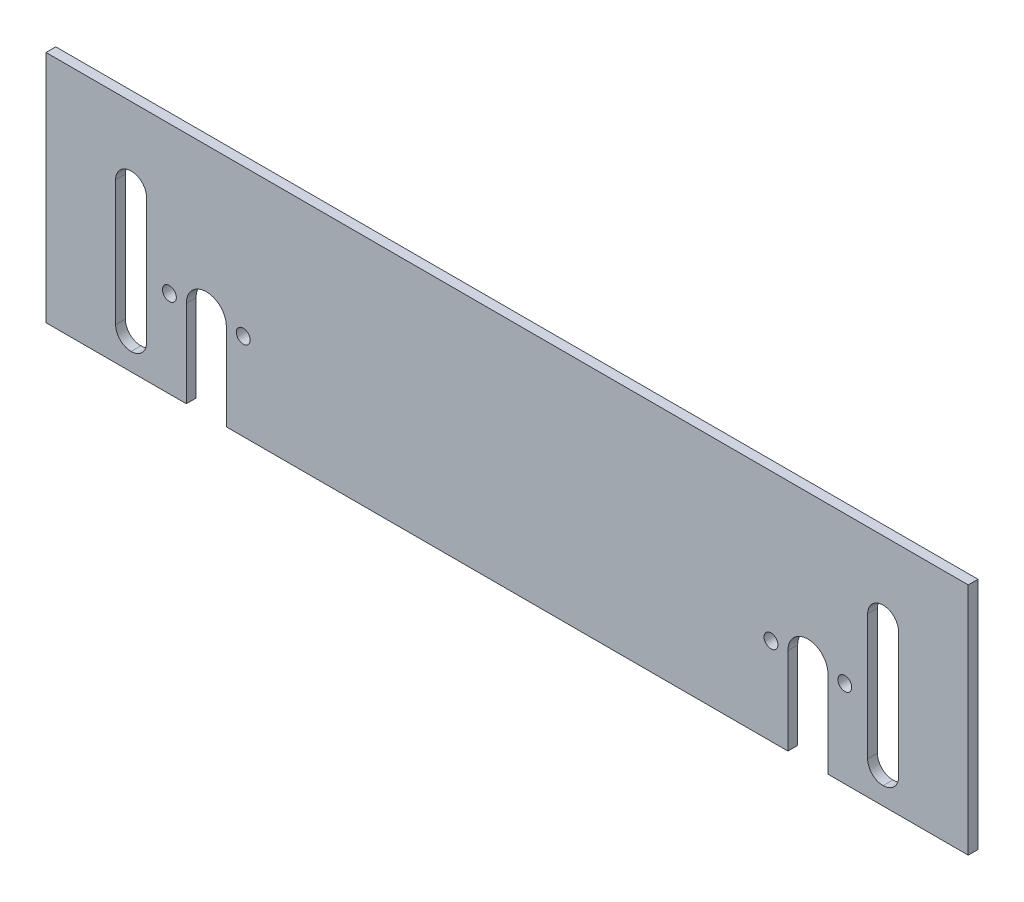
ISO-10303-21;
HEADER;
FILE_DESCRIPTION(('STEP AP214'),'2;1');
FILE_NAME('part.step','',(''),(''),'','','');
FILE_SCHEMA(('AUTOMOTIVE_DESIGN { 1 0 10303 214 1 1 1 1 }'));
ENDSEC;
DATA;
#1=APPLICATION_CONTEXT('core data for automotive mechanical design processes');
#2=APPLICATION_PROTOCOL_DEFINITION('international standard','automotive_design',2000,#1);
#3=PRODUCT_CONTEXT('',#1,'mechanical');
#4=PRODUCT('Part','Part','',(#3));
#5=PRODUCT_RELATED_PRODUCT_CATEGORY('part','',(#4));
#6=PRODUCT_DEFINITION_FORMATION('','',#4);
#7=PRODUCT_DEFINITION_CONTEXT('part definition',#1,'design');
#8=PRODUCT_DEFINITION('design','',#6,#7);
#9=PRODUCT_DEFINITION_SHAPE('','',#8);
#10=(LENGTH_UNIT() NAMED_UNIT(*) SI_UNIT(.MILLI.,.METRE.));
#11=(NAMED_UNIT(*) PLANE_ANGLE_UNIT() SI_UNIT($,.RADIAN.));
#12=(NAMED_UNIT(*) SI_UNIT($,.STERADIAN.) SOLID_ANGLE_UNIT());
#13=UNCERTAINTY_MEASURE_WITH_UNIT(LENGTH_MEASURE(1.E-05),#10,'distance_accuracy_value','');
#14=(GEOMETRIC_REPRESENTATION_CONTEXT(3) GLOBAL_UNCERTAINTY_ASSIGNED_CONTEXT((#13)) GLOBAL_UNIT_ASSIGNED_CONTEXT((#10,
#11,#12)) REPRESENTATION_CONTEXT('',''));
#15=CARTESIAN_POINT('',(0.,0.,0.));
#16=DIRECTION('',(0.,0.,1.));
#17=DIRECTION('',(1.,0.,0.));
#18=AXIS2_PLACEMENT_3D('',#15,#16,#17);
#19=CARTESIAN_POINT('',(0.,0.,3.175));
#20=DIRECTION('',(0.,0.,1.));
#21=DIRECTION('',(1.,0.,0.));
#22=AXIS2_PLACEMENT_3D('',#19,#20,#21);
#23=PLANE('',#22);
#24=CARTESIAN_POINT('',(85.7499999999999,-9.76249999999997,3.17500000000054));
#25=DIRECTION('',(0.,0.,-1.));
#26=DIRECTION('',(-1.,0.,0.));
#27=AXIS2_PLACEMENT_3D('',#24,#25,#26);
#28=CIRCLE('',#27,2.25);
#29=CARTESIAN_POINT('',(83.4999999999999,-9.76249999999997,3.17500000000054));
#30=VERTEX_POINT('',#29);
#31=EDGE_CURVE('E763',#30,#30,#28,.T.);
#32=ORIENTED_EDGE('',*,*,#31,.T.);
#33=EDGE_LOOP('',(#32));
#34=FACE_BOUND('',#33,.T.);
#35=CARTESIAN_POINT('',(109.75,-9.76249999999997,3.17500000000054));
#36=DIRECTION('',(0.,0.,-1.));
#37=DIRECTION('',(-1.,0.,0.));
#38=AXIS2_PLACEMENT_3D('',#35,#36,#37);
#39=CIRCLE('',#38,2.25);
#40=CARTESIAN_POINT('',(107.5,-9.76249999999997,3.17500000000054));
#41=VERTEX_POINT('',#40);
#42=EDGE_CURVE('E773',#41,#41,#39,.T.);
#43=ORIENTED_EDGE('',*,*,#42,.T.);
#44=EDGE_LOOP('',(#43));
#45=FACE_BOUND('',#44,.T.);
#46=CARTESIAN_POINT('',(-109.75,-9.76249999999999,3.17500000000054));
#47=DIRECTION('',(0.,0.,-1.));
#48=DIRECTION('',(-1.,0.,0.));
#49=AXIS2_PLACEMENT_3D('',#46,#47,#48);
#50=CIRCLE('',#49,2.25);
#51=CARTESIAN_POINT('',(-112.,-9.76249999999999,3.17500000000054));
#52=VERTEX_POINT('',#51);
#53=EDGE_CURVE('E779',#52,#52,#50,.T.);
#54=ORIENTED_EDGE('',*,*,#53,.T.);
#55=EDGE_LOOP('',(#54));
#56=FACE_BOUND('',#55,.T.);
#57=DIRECTION('',(1.,0.,0.));
#58=VECTOR('',#57,1.);
#59=CARTESIAN_POINT('',(-149.85,-38.0375,3.175));
#60=LINE('',#59,#58);
#61=CARTESIAN_POINT('',(-91.2500000000002,-38.0374999999988,3.17499999999994));
#62=VERTEX_POINT('',#61);
#63=CARTESIAN_POINT('',(91.2499999999999,-38.0374999999996,3.17499999999994));
#64=VERTEX_POINT('',#63);
#65=EDGE_CURVE('E421',#62,#64,#60,.T.);
#66=ORIENTED_EDGE('',*,*,#65,.T.);
#67=DIRECTION('',(0.,-0.999999999999986,0.));
#68=VECTOR('',#67,1.);
#69=CARTESIAN_POINT('',(91.2499999999999,0.,3.17499999999994));
#70=LINE('',#69,#68);
#71=CARTESIAN_POINT('',(91.2499999999999,-9.76249999999996,3.175));
#72=VERTEX_POINT('',#71);
#73=EDGE_CURVE('E235',#72,#64,#70,.T.);
#74=ORIENTED_EDGE('',*,*,#73,.F.);
#75=CARTESIAN_POINT('',(97.7499999999999,-9.76249999999997,3.17500000000006));
#76=DIRECTION('',(0.,0.,-0.999999999999993));
#77=DIRECTION('',(-1.,0.,0.));
#78=AXIS2_PLACEMENT_3D('',#75,#76,#77);
#79=CIRCLE('',#78,6.5);
#80=CARTESIAN_POINT('',(104.25,-9.76249999999997,3.175));
#81=VERTEX_POINT('',#80);
#82=EDGE_CURVE('E230',#72,#81,#79,.T.);
#83=ORIENTED_EDGE('',*,*,#82,.T.);
#84=DIRECTION('',(0.,-0.999999999999986,0.));
#85=VECTOR('',#84,1.);
#86=CARTESIAN_POINT('',(104.25,0.,3.17499999999994));
#87=LINE('',#86,#85);
#88=CARTESIAN_POINT('',(104.25,-38.0374999999996,3.17499999999994));
#89=VERTEX_POINT('',#88);
#90=EDGE_CURVE('E238',#81,#89,#87,.T.);
#91=ORIENTED_EDGE('',*,*,#90,.T.);
#92=CARTESIAN_POINT('',(149.85,-38.0375,3.175));
#93=VERTEX_POINT('',#92);
#94=EDGE_CURVE('E416',#89,#93,#60,.T.);
#95=ORIENTED_EDGE('',*,*,#94,.T.);
#96=DIRECTION('',(0.,1.,0.));
#97=VECTOR('',#96,1.);
#98=CARTESIAN_POINT('',(149.85,38.0375,3.175));
#99=LINE('',#98,#97);
#100=CARTESIAN_POINT('',(149.85,38.0375,3.175));
#101=VERTEX_POINT('',#100);
#102=EDGE_CURVE('E408',#93,#101,#99,.T.);
#103=ORIENTED_EDGE('',*,*,#102,.T.);
#104=DIRECTION('',(-1.,0.,0.));
#105=VECTOR('',#104,1.);
#106=CARTESIAN_POINT('',(-149.85,38.0375,3.175));
#107=LINE('',#106,#105);
#108=CARTESIAN_POINT('',(-149.85,38.0375,3.175));
#109=VERTEX_POINT('',#108);
#110=EDGE_CURVE('E411',#101,#109,#107,.T.);
#111=ORIENTED_EDGE('',*,*,#110,.T.);
#112=DIRECTION('',(0.,-1.,0.));
#113=VECTOR('',#112,1.);
#114=CARTESIAN_POINT('',(-149.85,38.0375,3.175));
#115=LINE('',#114,#113);
#116=CARTESIAN_POINT('',(-149.85,-38.0375,3.175));
#117=VERTEX_POINT('',#116);
#118=EDGE_CURVE('E414',#109,#117,#115,.T.);
#119=ORIENTED_EDGE('',*,*,#118,.T.);
#120=CARTESIAN_POINT('',(-104.25,-38.0374999999988,3.17499999999994));
#121=VERTEX_POINT('',#120);
#122=EDGE_CURVE('E417',#117,#121,#60,.T.);
#123=ORIENTED_EDGE('',*,*,#122,.T.);
#124=DIRECTION('',(0.,-0.999999999999962,0.));
#125=VECTOR('',#124,1.);
#126=CARTESIAN_POINT('',(-104.25,0.,3.17500000000054));
#127=LINE('',#126,#125);
#128=CARTESIAN_POINT('',(-104.25,-9.76250000000003,3.17500000000048));
#129=VERTEX_POINT('',#128);
#130=EDGE_CURVE('E270',#129,#121,#127,.T.);
#131=ORIENTED_EDGE('',*,*,#130,.F.);
#132=CARTESIAN_POINT('',(-97.7500000000002,-9.76250000000003,3.17500000000042));
#133=DIRECTION('',(0.,0.,-0.99999999999997));
#134=DIRECTION('',(-1.,0.,0.));
#135=AXIS2_PLACEMENT_3D('',#132,#133,#134);
#136=CIRCLE('',#135,6.5);
#137=CARTESIAN_POINT('',(-91.2500000000002,-9.76250000000003,3.17500000000018));
#138=VERTEX_POINT('',#137);
#139=EDGE_CURVE('E263',#129,#138,#136,.T.);
#140=ORIENTED_EDGE('',*,*,#139,.T.);
#141=DIRECTION('',(0.,-0.999999999999962,0.));
#142=VECTOR('',#141,1.);
#143=CARTESIAN_POINT('',(-91.2500000000002,0.,3.17499999999994));
#144=LINE('',#143,#142);
#145=EDGE_CURVE('E266',#138,#62,#144,.T.);
#146=ORIENTED_EDGE('',*,*,#145,.T.);
#147=EDGE_LOOP('',(#66,#74,#83,#91,#95,#103,#111,#119,#123,#131,#140,#146));
#148=FACE_BOUND('',#147,.T.);
#149=DIRECTION('',(0.,-1.,0.));
#150=VECTOR('',#149,1.);
#151=CARTESIAN_POINT('',(-117.160899999998,-27.2824354006741,3.175));
#152=LINE('',#151,#150);
#153=CARTESIAN_POINT('',(-117.160899999998,13.5125,3.175));
#154=VERTEX_POINT('',#153);
#155=CARTESIAN_POINT('',(-117.160899999998,-27.2824354006741,3.175));
#156=VERTEX_POINT('',#155);
#157=EDGE_CURVE('E306',#154,#156,#152,.T.);
#158=ORIENTED_EDGE('',*,*,#157,.T.);
#159=CARTESIAN_POINT('',(-122.160899999998,-27.2824354006741,3.175));
#160=DIRECTION('',(0.,0.,-1.));
#161=DIRECTION('',(1.,0.,0.));
#162=AXIS2_PLACEMENT_3D('',#159,#160,#161);
#163=CIRCLE('',#162,5.);
#164=CARTESIAN_POINT('',(-122.160899999998,-32.2824354006741,3.175));
#165=VERTEX_POINT('',#164);
#166=EDGE_CURVE('E259',#156,#165,#163,.T.);
#167=ORIENTED_EDGE('',*,*,#166,.T.);
#168=DIRECTION('',(-1.,0.,0.));
#169=VECTOR('',#168,1.);
#170=CARTESIAN_POINT('',(-122.160899999998,-32.2824354006741,3.175));
#171=LINE('',#170,#169);
#172=CARTESIAN_POINT('',(-122.224699999998,-32.2824354006741,3.175));
#173=VERTEX_POINT('',#172);
#174=EDGE_CURVE('E288',#165,#173,#171,.T.);
#175=ORIENTED_EDGE('',*,*,#174,.T.);
#176=CARTESIAN_POINT('',(-122.224699999998,-27.2824354006741,3.175));
#177=DIRECTION('',(0.,0.,-1.));
#178=DIRECTION('',(-1.,0.,0.));
#179=AXIS2_PLACEMENT_3D('',#176,#177,#178);
#180=CIRCLE('',#179,5.);
#181=CARTESIAN_POINT('',(-127.224699999998,-27.2824354006741,3.175));
#182=VERTEX_POINT('',#181);
#183=EDGE_CURVE('E321',#173,#182,#180,.T.);
#184=ORIENTED_EDGE('',*,*,#183,.T.);
#185=DIRECTION('',(0.,1.,0.));
#186=VECTOR('',#185,1.);
#187=CARTESIAN_POINT('',(-127.224699999998,-27.2824354006741,3.175));
#188=LINE('',#187,#186);
#189=CARTESIAN_POINT('',(-127.224699999998,13.5125,3.175));
#190=VERTEX_POINT('',#189);
#191=EDGE_CURVE('E318',#182,#190,#188,.T.);
#192=ORIENTED_EDGE('',*,*,#191,.T.);
#193=CARTESIAN_POINT('',(-122.224699999998,13.5125,3.175));
#194=DIRECTION('',(0.,0.,-1.));
#195=DIRECTION('',(-1.,0.,0.));
#196=AXIS2_PLACEMENT_3D('',#193,#194,#195);
#197=CIRCLE('',#196,5.);
#198=CARTESIAN_POINT('',(-122.224699999998,18.5125,3.175));
#199=VERTEX_POINT('',#198);
#200=EDGE_CURVE('E315',#190,#199,#197,.T.);
#201=ORIENTED_EDGE('',*,*,#200,.T.);
#202=DIRECTION('',(1.,0.,0.));
#203=VECTOR('',#202,1.);
#204=CARTESIAN_POINT('',(-122.160899999999,18.5125,3.175));
#205=LINE('',#204,#203);
#206=CARTESIAN_POINT('',(-122.160899999999,18.5125,3.175));
#207=VERTEX_POINT('',#206);
#208=EDGE_CURVE('E312',#199,#207,#205,.T.);
#209=ORIENTED_EDGE('',*,*,#208,.T.);
#210=CARTESIAN_POINT('',(-122.160899999998,13.5125,3.175));
#211=DIRECTION('',(0.,0.,-1.));
#212=DIRECTION('',(-1.,0.,0.));
#213=AXIS2_PLACEMENT_3D('',#210,#211,#212);
#214=CIRCLE('',#213,4.99999999999999);
#215=EDGE_CURVE('E309',#207,#154,#214,.T.);
#216=ORIENTED_EDGE('',*,*,#215,.T.);
#217=EDGE_LOOP('',(#158,#167,#175,#184,#192,#201,#209,#216));
#218=FACE_BOUND('',#217,.T.);
#219=CARTESIAN_POINT('',(122.160899999998,-27.2824354006741,3.175));
#220=DIRECTION('',(0.,0.,1.));
#221=DIRECTION('',(-1.,0.,0.));
#222=AXIS2_PLACEMENT_3D('',#219,#220,#221);
#223=CIRCLE('',#222,5.);
#224=CARTESIAN_POINT('',(117.160899999998,-27.2824354006741,3.175));
#225=VERTEX_POINT('',#224);
#226=CARTESIAN_POINT('',(122.160899999998,-32.2824354006741,3.175));
#227=VERTEX_POINT('',#226);
#228=EDGE_CURVE('E329',#225,#227,#223,.T.);
#229=ORIENTED_EDGE('',*,*,#228,.F.);
#230=DIRECTION('',(0.,-1.,0.));
#231=VECTOR('',#230,1.);
#232=CARTESIAN_POINT('',(117.160899999998,-27.2824354006741,3.175));
#233=LINE('',#232,#231);
#234=CARTESIAN_POINT('',(117.160899999998,13.5125,3.175));
#235=VERTEX_POINT('',#234);
#236=EDGE_CURVE('E348',#235,#225,#233,.T.);
#237=ORIENTED_EDGE('',*,*,#236,.F.);
#238=CARTESIAN_POINT('',(122.160899999998,13.5125,3.175));
#239=DIRECTION('',(0.,0.,1.));
#240=DIRECTION('',(1.,0.,0.));
#241=AXIS2_PLACEMENT_3D('',#238,#239,#240);
#242=CIRCLE('',#241,4.99999999999999);
#243=CARTESIAN_POINT('',(122.160899999999,18.5125,3.175));
#244=VERTEX_POINT('',#243);
#245=EDGE_CURVE('E386',#244,#235,#242,.T.);
#246=ORIENTED_EDGE('',*,*,#245,.F.);
#247=DIRECTION('',(-1.,0.,0.));
#248=VECTOR('',#247,1.);
#249=CARTESIAN_POINT('',(122.160899999999,18.5125,3.175));
#250=LINE('',#249,#248);
#251=CARTESIAN_POINT('',(122.224699999998,18.5125,3.175));
#252=VERTEX_POINT('',#251);
#253=EDGE_CURVE('E383',#252,#244,#250,.T.);
#254=ORIENTED_EDGE('',*,*,#253,.F.);
#255=CARTESIAN_POINT('',(122.224699999998,13.5125,3.175));
#256=DIRECTION('',(0.,0.,1.));
#257=DIRECTION('',(1.,0.,0.));
#258=AXIS2_PLACEMENT_3D('',#255,#256,#257);
#259=CIRCLE('',#258,5.);
#260=CARTESIAN_POINT('',(127.224699999998,13.5125,3.175));
#261=VERTEX_POINT('',#260);
#262=EDGE_CURVE('E380',#261,#252,#259,.T.);
#263=ORIENTED_EDGE('',*,*,#262,.F.);
#264=DIRECTION('',(0.,1.,0.));
#265=VECTOR('',#264,1.);
#266=CARTESIAN_POINT('',(127.224699999998,-27.2824354006741,3.175));
#267=LINE('',#266,#265);
#268=CARTESIAN_POINT('',(127.224699999998,-27.2824354006741,3.175));
#269=VERTEX_POINT('',#268);
#270=EDGE_CURVE('E377',#269,#261,#267,.T.);
#271=ORIENTED_EDGE('',*,*,#270,.F.);
#272=CARTESIAN_POINT('',(122.224699999998,-27.2824354006741,3.175));
#273=DIRECTION('',(0.,0.,1.));
#274=DIRECTION('',(1.,0.,0.));
#275=AXIS2_PLACEMENT_3D('',#272,#273,#274);
#276=CIRCLE('',#275,5.);
#277=CARTESIAN_POINT('',(122.224699999998,-32.2824354006741,3.175));
#278=VERTEX_POINT('',#277);
#279=EDGE_CURVE('E374',#278,#269,#276,.T.);
#280=ORIENTED_EDGE('',*,*,#279,.F.);
#281=DIRECTION('',(1.,0.,0.));
#282=VECTOR('',#281,1.);
#283=CARTESIAN_POINT('',(122.160899999998,-32.2824354006741,3.175));
#284=LINE('',#283,#282);
#285=EDGE_CURVE('E371',#227,#278,#284,.T.);
#286=ORIENTED_EDGE('',*,*,#285,.F.);
#287=EDGE_LOOP('',(#229,#237,#246,#254,#263,#271,#280,#286));
#288=FACE_BOUND('',#287,.T.);
#289=CARTESIAN_POINT('',(-85.7500000000002,-9.76249999999999,3.17500000000054));
#290=DIRECTION('',(0.,0.,-1.));
#291=DIRECTION('',(-1.,0.,0.));
#292=AXIS2_PLACEMENT_3D('',#289,#290,#291);
#293=CIRCLE('',#292,2.25);
#294=CARTESIAN_POINT('',(-88.0000000000002,-9.76249999999999,3.17500000000054));
#295=VERTEX_POINT('',#294);
#296=EDGE_CURVE('E250',#295,#295,#293,.T.);
#297=ORIENTED_EDGE('',*,*,#296,.T.);
#298=EDGE_LOOP('',(#297));
#299=FACE_BOUND('',#298,.T.);
#300=ADVANCED_FACE('F41',(#34,#45,#56,#148,#218,#288,#299),#23,.T.);
#301=CARTESIAN_POINT('',(0.,0.,0.));
#302=DIRECTION('',(0.,0.,1.));
#303=DIRECTION('',(1.,0.,0.));
#304=AXIS2_PLACEMENT_3D('',#301,#302,#303);
#305=PLANE('',#304);
#306=CARTESIAN_POINT('',(85.7499999999999,-9.76249999999997,0.));
#307=DIRECTION('',(0.,0.,-1.));
#308=DIRECTION('',(-1.,0.,0.));
#309=AXIS2_PLACEMENT_3D('',#306,#307,#308);
#310=CIRCLE('',#309,2.25);
#311=CARTESIAN_POINT('',(83.4999999999999,-9.76249999999997,0.));
#312=VERTEX_POINT('',#311);
#313=EDGE_CURVE('E766',#312,#312,#310,.T.);
#314=ORIENTED_EDGE('',*,*,#313,.F.);
#315=EDGE_LOOP('',(#314));
#316=FACE_BOUND('',#315,.T.);
#317=CARTESIAN_POINT('',(109.75,-9.76249999999997,0.));
#318=DIRECTION('',(0.,0.,-1.));
#319=DIRECTION('',(-1.,0.,0.));
#320=AXIS2_PLACEMENT_3D('',#317,#318,#319);
#321=CIRCLE('',#320,2.25);
#322=CARTESIAN_POINT('',(107.5,-9.76249999999997,0.));
#323=VERTEX_POINT('',#322);
#324=EDGE_CURVE('E768',#323,#323,#321,.T.);
#325=ORIENTED_EDGE('',*,*,#324,.F.);
#326=EDGE_LOOP('',(#325));
#327=FACE_BOUND('',#326,.T.);
#328=CARTESIAN_POINT('',(-109.75,-9.76249999999999,0.));
#329=DIRECTION('',(0.,0.,-1.));
#330=DIRECTION('',(-1.,0.,0.));
#331=AXIS2_PLACEMENT_3D('',#328,#329,#330);
#332=CIRCLE('',#331,2.25);
#333=CARTESIAN_POINT('',(-112.,-9.76249999999999,0.));
#334=VERTEX_POINT('',#333);
#335=EDGE_CURVE('E776',#334,#334,#332,.T.);
#336=ORIENTED_EDGE('',*,*,#335,.F.);
#337=EDGE_LOOP('',(#336));
#338=FACE_BOUND('',#337,.T.);
#339=DIRECTION('',(0.,-1.,0.));
#340=VECTOR('',#339,1.);
#341=CARTESIAN_POINT('',(117.160899999998,-27.2824354006741,0.));
#342=LINE('',#341,#340);
#343=CARTESIAN_POINT('',(117.160899999998,13.5125,0.));
#344=VERTEX_POINT('',#343);
#345=CARTESIAN_POINT('',(117.160899999998,-27.2824354006741,0.));
#346=VERTEX_POINT('',#345);
#347=EDGE_CURVE('E366',#344,#346,#342,.T.);
#348=ORIENTED_EDGE('',*,*,#347,.T.);
#349=CARTESIAN_POINT('',(122.160899999998,-27.2824354006741,0.));
#350=DIRECTION('',(0.,0.,1.));
#351=DIRECTION('',(-1.,0.,0.));
#352=AXIS2_PLACEMENT_3D('',#349,#350,#351);
#353=CIRCLE('',#352,5.);
#354=CARTESIAN_POINT('',(122.160899999998,-32.2824354006741,0.));
#355=VERTEX_POINT('',#354);
#356=EDGE_CURVE('E344',#346,#355,#353,.T.);
#357=ORIENTED_EDGE('',*,*,#356,.T.);
#358=DIRECTION('',(1.,0.,0.));
#359=VECTOR('',#358,1.);
#360=CARTESIAN_POINT('',(122.160899999998,-32.2824354006741,0.));
#361=LINE('',#360,#359);
#362=CARTESIAN_POINT('',(122.224699999998,-32.2824354006741,0.));
#363=VERTEX_POINT('',#362);
#364=EDGE_CURVE('E347',#355,#363,#361,.T.);
#365=ORIENTED_EDGE('',*,*,#364,.T.);
#366=CARTESIAN_POINT('',(122.224699999998,-27.2824354006741,0.));
#367=DIRECTION('',(0.,0.,1.));
#368=DIRECTION('',(1.,0.,0.));
#369=AXIS2_PLACEMENT_3D('',#366,#367,#368);
#370=CIRCLE('',#369,5.);
#371=CARTESIAN_POINT('',(127.224699999998,-27.2824354006741,0.));
#372=VERTEX_POINT('',#371);
#373=EDGE_CURVE('E351',#363,#372,#370,.T.);
#374=ORIENTED_EDGE('',*,*,#373,.T.);
#375=DIRECTION('',(0.,1.,0.));
#376=VECTOR('',#375,1.);
#377=CARTESIAN_POINT('',(127.224699999998,-27.2824354006741,0.));
#378=LINE('',#377,#376);
#379=CARTESIAN_POINT('',(127.224699999998,13.5125,0.));
#380=VERTEX_POINT('',#379);
#381=EDGE_CURVE('E354',#372,#380,#378,.T.);
#382=ORIENTED_EDGE('',*,*,#381,.T.);
#383=CARTESIAN_POINT('',(122.224699999998,13.5125,0.));
#384=DIRECTION('',(0.,0.,1.));
#385=DIRECTION('',(1.,0.,0.));
#386=AXIS2_PLACEMENT_3D('',#383,#384,#385);
#387=CIRCLE('',#386,5.);
#388=CARTESIAN_POINT('',(122.224699999998,18.5125,0.));
#389=VERTEX_POINT('',#388);
#390=EDGE_CURVE('E357',#380,#389,#387,.T.);
#391=ORIENTED_EDGE('',*,*,#390,.T.);
#392=DIRECTION('',(-1.,0.,0.));
#393=VECTOR('',#392,1.);
#394=CARTESIAN_POINT('',(122.160899999999,18.5125,0.));
#395=LINE('',#394,#393);
#396=CARTESIAN_POINT('',(122.160899999999,18.5125,0.));
#397=VERTEX_POINT('',#396);
#398=EDGE_CURVE('E360',#389,#397,#395,.T.);
#399=ORIENTED_EDGE('',*,*,#398,.T.);
#400=CARTESIAN_POINT('',(122.160899999998,13.5125,0.));
#401=DIRECTION('',(0.,0.,1.));
#402=DIRECTION('',(1.,0.,0.));
#403=AXIS2_PLACEMENT_3D('',#400,#401,#402);
#404=CIRCLE('',#403,4.99999999999999);
#405=EDGE_CURVE('E363',#397,#344,#404,.T.);
#406=ORIENTED_EDGE('',*,*,#405,.T.);
#407=EDGE_LOOP('',(#348,#357,#365,#374,#382,#391,#399,#406));
#408=FACE_BOUND('',#407,.T.);
#409=CARTESIAN_POINT('',(-122.160899999998,-27.2824354006741,0.));
#410=DIRECTION('',(0.,0.,-1.));
#411=DIRECTION('',(1.,0.,0.));
#412=AXIS2_PLACEMENT_3D('',#409,#410,#411);
#413=CIRCLE('',#412,5.);
#414=CARTESIAN_POINT('',(-117.160899999998,-27.2824354006741,0.));
#415=VERTEX_POINT('',#414);
#416=CARTESIAN_POINT('',(-122.160899999998,-32.2824354006741,0.));
#417=VERTEX_POINT('',#416);
#418=EDGE_CURVE('E285',#415,#417,#413,.T.);
#419=ORIENTED_EDGE('',*,*,#418,.F.);
#420=DIRECTION('',(0.,-1.,0.));
#421=VECTOR('',#420,1.);
#422=CARTESIAN_POINT('',(-117.160899999998,-27.2824354006741,0.));
#423=LINE('',#422,#421);
#424=CARTESIAN_POINT('',(-117.160899999998,13.5125,0.));
#425=VERTEX_POINT('',#424);
#426=EDGE_CURVE('E287',#425,#415,#423,.T.);
#427=ORIENTED_EDGE('',*,*,#426,.F.);
#428=CARTESIAN_POINT('',(-122.160899999998,13.5125,0.));
#429=DIRECTION('',(0.,0.,-1.));
#430=DIRECTION('',(-1.,0.,0.));
#431=AXIS2_PLACEMENT_3D('',#428,#429,#430);
#432=CIRCLE('',#431,4.99999999999999);
#433=CARTESIAN_POINT('',(-122.160899999999,18.5125,0.));
#434=VERTEX_POINT('',#433);
#435=EDGE_CURVE('E290',#434,#425,#432,.T.);
#436=ORIENTED_EDGE('',*,*,#435,.F.);
#437=DIRECTION('',(1.,0.,0.));
#438=VECTOR('',#437,1.);
#439=CARTESIAN_POINT('',(-122.160899999999,18.5125,0.));
#440=LINE('',#439,#438);
#441=CARTESIAN_POINT('',(-122.224699999998,18.5125,0.));
#442=VERTEX_POINT('',#441);
#443=EDGE_CURVE('E293',#442,#434,#440,.T.);
#444=ORIENTED_EDGE('',*,*,#443,.F.);
#445=CARTESIAN_POINT('',(-122.224699999998,13.5125,0.));
#446=DIRECTION('',(0.,0.,-1.));
#447=DIRECTION('',(-1.,0.,0.));
#448=AXIS2_PLACEMENT_3D('',#445,#446,#447);
#449=CIRCLE('',#448,5.);
#450=CARTESIAN_POINT('',(-127.224699999998,13.5125,0.));
#451=VERTEX_POINT('',#450);
#452=EDGE_CURVE('E295',#451,#442,#449,.T.);
#453=ORIENTED_EDGE('',*,*,#452,.F.);
#454=DIRECTION('',(0.,1.,0.));
#455=VECTOR('',#454,1.);
#456=CARTESIAN_POINT('',(-127.224699999998,-27.2824354006741,0.));
#457=LINE('',#456,#455);
#458=CARTESIAN_POINT('',(-127.224699999998,-27.2824354006741,0.));
#459=VERTEX_POINT('',#458);
#460=EDGE_CURVE('E297',#459,#451,#457,.T.);
#461=ORIENTED_EDGE('',*,*,#460,.F.);
#462=CARTESIAN_POINT('',(-122.224699999998,-27.2824354006741,0.));
#463=DIRECTION('',(0.,0.,-1.));
#464=DIRECTION('',(-1.,0.,0.));
#465=AXIS2_PLACEMENT_3D('',#462,#463,#464);
#466=CIRCLE('',#465,5.);
#467=CARTESIAN_POINT('',(-122.224699999998,-32.2824354006741,0.));
#468=VERTEX_POINT('',#467);
#469=EDGE_CURVE('E299',#468,#459,#466,.T.);
#470=ORIENTED_EDGE('',*,*,#469,.F.);
#471=DIRECTION('',(-1.,0.,0.));
#472=VECTOR('',#471,1.);
#473=CARTESIAN_POINT('',(-122.160899999998,-32.2824354006741,0.));
#474=LINE('',#473,#472);
#475=EDGE_CURVE('E301',#417,#468,#474,.T.);
#476=ORIENTED_EDGE('',*,*,#475,.F.);
#477=EDGE_LOOP('',(#419,#427,#436,#444,#453,#461,#470,#476));
#478=FACE_BOUND('',#477,.T.);
#479=DIRECTION('',(0.,-0.999999999999986,0.));
#480=VECTOR('',#479,1.);
#481=CARTESIAN_POINT('',(91.2499999999999,0.,0.));
#482=LINE('',#481,#480);
#483=CARTESIAN_POINT('',(91.2499999999999,-9.76249999999996,0.));
#484=VERTEX_POINT('',#483);
#485=CARTESIAN_POINT('',(91.2499999999999,-38.0374999999996,0.));
#486=VERTEX_POINT('',#485);
#487=EDGE_CURVE('E245',#484,#486,#482,.T.);
#488=ORIENTED_EDGE('',*,*,#487,.T.);
#489=DIRECTION('',(1.,0.,0.));
#490=VECTOR('',#489,1.);
#491=CARTESIAN_POINT('',(-149.85,-38.0375,0.));
#492=LINE('',#491,#490);
#493=CARTESIAN_POINT('',(-91.2500000000002,-38.0375,0.));
#494=VERTEX_POINT('',#493);
#495=EDGE_CURVE('E431',#494,#486,#492,.T.);
#496=ORIENTED_EDGE('',*,*,#495,.F.);
#497=DIRECTION('',(0.,-0.999999999999962,0.));
#498=VECTOR('',#497,1.);
#499=CARTESIAN_POINT('',(-91.2500000000002,0.,0.));
#500=LINE('',#499,#498);
#501=CARTESIAN_POINT('',(-91.2500000000002,-9.76250000000003,2.35922392732832E-13));
#502=VERTEX_POINT('',#501);
#503=EDGE_CURVE('E64',#502,#494,#500,.T.);
#504=ORIENTED_EDGE('',*,*,#503,.F.);
#505=CARTESIAN_POINT('',(-97.7500000000002,-9.76250000000003,4.71844785465692E-13));
#506=DIRECTION('',(0.,0.,-0.99999999999997));
#507=DIRECTION('',(-1.,0.,0.));
#508=AXIS2_PLACEMENT_3D('',#505,#506,#507);
#509=CIRCLE('',#508,6.5);
#510=CARTESIAN_POINT('',(-104.25,-9.76250000000003,5.34294830600857E-13));
#511=VERTEX_POINT('',#510);
#512=EDGE_CURVE('E273',#511,#502,#509,.T.);
#513=ORIENTED_EDGE('',*,*,#512,.F.);
#514=DIRECTION('',(0.,-0.999999999999962,0.));
#515=VECTOR('',#514,1.);
#516=CARTESIAN_POINT('',(-104.25,0.,5.96744875736022E-13));
#517=LINE('',#516,#515);
#518=CARTESIAN_POINT('',(-104.25,-38.0374999999988,0.));
#519=VERTEX_POINT('',#518);
#520=EDGE_CURVE('E267',#511,#519,#517,.T.);
#521=ORIENTED_EDGE('',*,*,#520,.T.);
#522=CARTESIAN_POINT('',(-149.85,-38.0375,0.));
#523=VERTEX_POINT('',#522);
#524=EDGE_CURVE('E412',#523,#519,#492,.T.);
#525=ORIENTED_EDGE('',*,*,#524,.F.);
#526=DIRECTION('',(0.,-1.,0.));
#527=VECTOR('',#526,1.);
#528=CARTESIAN_POINT('',(-149.85,38.0375,0.));
#529=LINE('',#528,#527);
#530=CARTESIAN_POINT('',(-149.85,38.0375,0.));
#531=VERTEX_POINT('',#530);
#532=EDGE_CURVE('E426',#531,#523,#529,.T.);
#533=ORIENTED_EDGE('',*,*,#532,.F.);
#534=DIRECTION('',(-1.,0.,0.));
#535=VECTOR('',#534,1.);
#536=CARTESIAN_POINT('',(-149.85,38.0375,0.));
#537=LINE('',#536,#535);
#538=CARTESIAN_POINT('',(149.85,38.0375,0.));
#539=VERTEX_POINT('',#538);
#540=EDGE_CURVE('E424',#539,#531,#537,.T.);
#541=ORIENTED_EDGE('',*,*,#540,.F.);
#542=DIRECTION('',(0.,1.,0.));
#543=VECTOR('',#542,1.);
#544=CARTESIAN_POINT('',(149.85,38.0375,0.));
#545=LINE('',#544,#543);
#546=CARTESIAN_POINT('',(149.85,-38.0375,0.));
#547=VERTEX_POINT('',#546);
#548=EDGE_CURVE('E393',#547,#539,#545,.T.);
#549=ORIENTED_EDGE('',*,*,#548,.F.);
#550=CARTESIAN_POINT('',(104.25,-38.0375,0.));
#551=VERTEX_POINT('',#550);
#552=EDGE_CURVE('E428',#551,#547,#492,.T.);
#553=ORIENTED_EDGE('',*,*,#552,.F.);
#554=DIRECTION('',(0.,-0.999999999999986,0.));
#555=VECTOR('',#554,1.);
#556=CARTESIAN_POINT('',(104.25,0.,0.));
#557=LINE('',#556,#555);
#558=CARTESIAN_POINT('',(104.25,-9.76249999999997,0.));
#559=VERTEX_POINT('',#558);
#560=EDGE_CURVE('E56',#559,#551,#557,.T.);
#561=ORIENTED_EDGE('',*,*,#560,.F.);
#562=CARTESIAN_POINT('',(97.7499999999999,-9.76249999999997,1.11022302462516E-13));
#563=DIRECTION('',(0.,0.,-0.999999999999993));
#564=DIRECTION('',(-1.,0.,0.));
#565=AXIS2_PLACEMENT_3D('',#562,#563,#564);
#566=CIRCLE('',#565,6.5);
#567=EDGE_CURVE('E233',#484,#559,#566,.T.);
#568=ORIENTED_EDGE('',*,*,#567,.F.);
#569=EDGE_LOOP('',(#488,#496,#504,#513,#521,#525,#533,#541,#549,#553,#561,#568));
#570=FACE_BOUND('',#569,.T.);
#571=CARTESIAN_POINT('',(-85.7500000000002,-9.76249999999999,0.));
#572=DIRECTION('',(0.,0.,-1.));
#573=DIRECTION('',(-1.,0.,0.));
#574=AXIS2_PLACEMENT_3D('',#571,#572,#573);
#575=CIRCLE('',#574,2.25);
#576=CARTESIAN_POINT('',(-88.0000000000002,-9.76249999999999,0.));
#577=VERTEX_POINT('',#576);
#578=EDGE_CURVE('E781',#577,#577,#575,.T.);
#579=ORIENTED_EDGE('',*,*,#578,.F.);
#580=EDGE_LOOP('',(#579));
#581=FACE_BOUND('',#580,.T.);
#582=ADVANCED_FACE('F446',(#316,#327,#338,#408,#478,#570,#581),#305,.F.);
#583=CARTESIAN_POINT('',(-149.85,-38.0375,3.175));
#584=DIRECTION('',(0.,1.,0.));
#585=DIRECTION('',(0.,0.,1.));
#586=AXIS2_PLACEMENT_3D('',#583,#584,#585);
#587=PLANE('',#586);
#588=DIRECTION('',(0.,0.,-1.));
#589=VECTOR('',#588,1.);
#590=CARTESIAN_POINT('',(91.2499999999999,-38.0374999999996,3.17499999999994));
#591=LINE('',#590,#589);
#592=EDGE_CURVE('E260',#64,#486,#591,.T.);
#593=ORIENTED_EDGE('',*,*,#592,.F.);
#594=ORIENTED_EDGE('',*,*,#65,.F.);
#595=DIRECTION('',(0.,0.,-1.));
#596=VECTOR('',#595,1.);
#597=CARTESIAN_POINT('',(-91.2500000000002,-38.0374999999988,3.17499999999994));
#598=LINE('',#597,#596);
#599=EDGE_CURVE('E282',#62,#494,#598,.T.);
#600=ORIENTED_EDGE('',*,*,#599,.T.);
#601=ORIENTED_EDGE('',*,*,#495,.T.);
#602=EDGE_LOOP('',(#593,#594,#600,#601));
#603=FACE_BOUND('',#602,.T.);
#604=ADVANCED_FACE('F467',(#603),#587,.F.);
#605=DIRECTION('',(0.,0.,-1.));
#606=VECTOR('',#605,1.);
#607=CARTESIAN_POINT('',(-104.25,-38.0374999999988,3.17499999999994));
#608=LINE('',#607,#606);
#609=EDGE_CURVE('E280',#121,#519,#608,.T.);
#610=ORIENTED_EDGE('',*,*,#609,.F.);
#611=ORIENTED_EDGE('',*,*,#122,.F.);
#612=DIRECTION('',(0.,0.,-1.));
#613=VECTOR('',#612,1.);
#614=CARTESIAN_POINT('',(-149.85,-38.0375,3.175));
#615=LINE('',#614,#613);
#616=EDGE_CURVE('E434',#117,#523,#615,.T.);
#617=ORIENTED_EDGE('',*,*,#616,.T.);
#618=ORIENTED_EDGE('',*,*,#524,.T.);
#619=EDGE_LOOP('',(#610,#611,#617,#618));
#620=FACE_BOUND('',#619,.T.);
#621=ADVANCED_FACE('F453',(#620),#587,.F.);
#622=CARTESIAN_POINT('',(149.85,38.0375,3.175));
#623=DIRECTION('',(-1.,0.,0.));
#624=DIRECTION('',(0.,0.,1.));
#625=AXIS2_PLACEMENT_3D('',#622,#623,#624);
#626=PLANE('',#625);
#627=ORIENTED_EDGE('',*,*,#548,.T.);
#628=DIRECTION('',(0.,0.,-1.));
#629=VECTOR('',#628,1.);
#630=CARTESIAN_POINT('',(149.85,38.0375,3.175));
#631=LINE('',#630,#629);
#632=EDGE_CURVE('E11',#101,#539,#631,.T.);
#633=ORIENTED_EDGE('',*,*,#632,.F.);
#634=ORIENTED_EDGE('',*,*,#102,.F.);
#635=DIRECTION('',(0.,0.,-1.));
#636=VECTOR('',#635,1.);
#637=CARTESIAN_POINT('',(149.85,-38.0375,3.175));
#638=LINE('',#637,#636);
#639=EDGE_CURVE('E420',#93,#547,#638,.T.);
#640=ORIENTED_EDGE('',*,*,#639,.T.);
#641=EDGE_LOOP('',(#627,#633,#634,#640));
#642=FACE_BOUND('',#641,.T.);
#643=ADVANCED_FACE('F43',(#642),#626,.F.);
#644=CARTESIAN_POINT('',(-149.85,38.0375,3.175));
#645=DIRECTION('',(0.,-1.,0.));
#646=DIRECTION('',(0.,0.,-1.));
#647=AXIS2_PLACEMENT_3D('',#644,#645,#646);
#648=PLANE('',#647);
#649=ORIENTED_EDGE('',*,*,#540,.T.);
#650=DIRECTION('',(0.,0.,-1.));
#651=VECTOR('',#650,1.);
#652=CARTESIAN_POINT('',(-149.85,38.0375,3.175));
#653=LINE('',#652,#651);
#654=EDGE_CURVE('E49',#109,#531,#653,.T.);
#655=ORIENTED_EDGE('',*,*,#654,.F.);
#656=ORIENTED_EDGE('',*,*,#110,.F.);
#657=ORIENTED_EDGE('',*,*,#632,.T.);
#658=EDGE_LOOP('',(#649,#655,#656,#657));
#659=FACE_BOUND('',#658,.T.);
#660=ADVANCED_FACE('F458',(#659),#648,.F.);
#661=CARTESIAN_POINT('',(-149.85,38.0375,3.175));
#662=DIRECTION('',(1.,0.,0.));
#663=DIRECTION('',(0.,0.,-1.));
#664=AXIS2_PLACEMENT_3D('',#661,#662,#663);
#665=PLANE('',#664);
#666=ORIENTED_EDGE('',*,*,#532,.T.);
#667=ORIENTED_EDGE('',*,*,#616,.F.);
#668=ORIENTED_EDGE('',*,*,#118,.F.);
#669=ORIENTED_EDGE('',*,*,#654,.T.);
#670=EDGE_LOOP('',(#666,#667,#668,#669));
#671=FACE_BOUND('',#670,.T.);
#672=ADVANCED_FACE('F441',(#671),#665,.F.);
#673=ORIENTED_EDGE('',*,*,#94,.F.);
#674=DIRECTION('',(0.,0.,-1.));
#675=VECTOR('',#674,1.);
#676=CARTESIAN_POINT('',(104.25,-38.0374999999996,3.17499999999994));
#677=LINE('',#676,#675);
#678=EDGE_CURVE('E234',#89,#551,#677,.T.);
#679=ORIENTED_EDGE('',*,*,#678,.T.);
#680=ORIENTED_EDGE('',*,*,#552,.T.);
#681=ORIENTED_EDGE('',*,*,#639,.F.);
#682=EDGE_LOOP('',(#673,#679,#680,#681));
#683=FACE_BOUND('',#682,.T.);
#684=ADVANCED_FACE('F497',(#683),#587,.F.);
#685=CARTESIAN_POINT('',(122.160899999998,-27.2824354006741,0.));
#686=DIRECTION('',(0.,0.,1.));
#687=DIRECTION('',(1.,0.,0.));
#688=AXIS2_PLACEMENT_3D('',#685,#686,#687);
#689=CYLINDRICAL_SURFACE('',#688,5.);
#690=ORIENTED_EDGE('',*,*,#228,.T.);
#691=DIRECTION('',(0.,0.,1.));
#692=VECTOR('',#691,1.);
#693=CARTESIAN_POINT('',(122.160899999998,-32.2824354006741,0.));
#694=LINE('',#693,#692);
#695=EDGE_CURVE('E369',#355,#227,#694,.T.);
#696=ORIENTED_EDGE('',*,*,#695,.F.);
#697=ORIENTED_EDGE('',*,*,#356,.F.);
#698=DIRECTION('',(0.,0.,1.));
#699=VECTOR('',#698,1.);
#700=CARTESIAN_POINT('',(117.160899999998,-27.2824354006741,0.));
#701=LINE('',#700,#699);
#702=EDGE_CURVE('E391',#346,#225,#701,.T.);
#703=ORIENTED_EDGE('',*,*,#702,.T.);
#704=EDGE_LOOP('',(#690,#696,#697,#703));
#705=FACE_BOUND('',#704,.T.);
#706=ADVANCED_FACE('F494',(#705),#689,.F.);
#707=CARTESIAN_POINT('',(117.160899999998,-27.2824354006741,0.));
#708=DIRECTION('',(-1.,0.,0.));
#709=DIRECTION('',(0.,-1.,0.));
#710=AXIS2_PLACEMENT_3D('',#707,#708,#709);
#711=PLANE('',#710);
#712=ORIENTED_EDGE('',*,*,#236,.T.);
#713=ORIENTED_EDGE('',*,*,#702,.F.);
#714=ORIENTED_EDGE('',*,*,#347,.F.);
#715=DIRECTION('',(0.,0.,1.));
#716=VECTOR('',#715,1.);
#717=CARTESIAN_POINT('',(117.160899999998,13.5125,0.));
#718=LINE('',#717,#716);
#719=EDGE_CURVE('E394',#344,#235,#718,.T.);
#720=ORIENTED_EDGE('',*,*,#719,.T.);
#721=EDGE_LOOP('',(#712,#713,#714,#720));
#722=FACE_BOUND('',#721,.T.);
#723=ADVANCED_FACE('F639',(#722),#711,.F.);
#724=CARTESIAN_POINT('',(122.160899999998,13.5125,0.));
#725=DIRECTION('',(0.,0.,1.));
#726=DIRECTION('',(1.,0.,0.));
#727=AXIS2_PLACEMENT_3D('',#724,#725,#726);
#728=CYLINDRICAL_SURFACE('',#727,4.99999999999999);
#729=ORIENTED_EDGE('',*,*,#245,.T.);
#730=ORIENTED_EDGE('',*,*,#719,.F.);
#731=ORIENTED_EDGE('',*,*,#405,.F.);
#732=DIRECTION('',(0.,0.,1.));
#733=VECTOR('',#732,1.);
#734=CARTESIAN_POINT('',(122.160899999999,18.5125,0.));
#735=LINE('',#734,#733);
#736=EDGE_CURVE('E396',#397,#244,#735,.T.);
#737=ORIENTED_EDGE('',*,*,#736,.T.);
#738=EDGE_LOOP('',(#729,#730,#731,#737));
#739=FACE_BOUND('',#738,.T.);
#740=ADVANCED_FACE('F630',(#739),#728,.F.);
#741=CARTESIAN_POINT('',(122.160899999999,18.5125,0.));
#742=DIRECTION('',(0.,1.,0.));
#743=DIRECTION('',(0.,0.,1.));
#744=AXIS2_PLACEMENT_3D('',#741,#742,#743);
#745=PLANE('',#744);
#746=ORIENTED_EDGE('',*,*,#253,.T.);
#747=ORIENTED_EDGE('',*,*,#736,.F.);
#748=ORIENTED_EDGE('',*,*,#398,.F.);
#749=DIRECTION('',(0.,0.,1.));
#750=VECTOR('',#749,1.);
#751=CARTESIAN_POINT('',(122.224699999998,18.5125,0.));
#752=LINE('',#751,#750);
#753=EDGE_CURVE('E398',#389,#252,#752,.T.);
#754=ORIENTED_EDGE('',*,*,#753,.T.);
#755=EDGE_LOOP('',(#746,#747,#748,#754));
#756=FACE_BOUND('',#755,.T.);
#757=ADVANCED_FACE('F621',(#756),#745,.F.);
#758=CARTESIAN_POINT('',(122.224699999998,13.5125,0.));
#759=DIRECTION('',(0.,0.,1.));
#760=DIRECTION('',(1.,0.,0.));
#761=AXIS2_PLACEMENT_3D('',#758,#759,#760);
#762=CYLINDRICAL_SURFACE('',#761,5.);
#763=ORIENTED_EDGE('',*,*,#262,.T.);
#764=ORIENTED_EDGE('',*,*,#753,.F.);
#765=ORIENTED_EDGE('',*,*,#390,.F.);
#766=DIRECTION('',(0.,0.,1.));
#767=VECTOR('',#766,1.);
#768=CARTESIAN_POINT('',(127.224699999998,13.5125,0.));
#769=LINE('',#768,#767);
#770=EDGE_CURVE('E400',#380,#261,#769,.T.);
#771=ORIENTED_EDGE('',*,*,#770,.T.);
#772=EDGE_LOOP('',(#763,#764,#765,#771));
#773=FACE_BOUND('',#772,.T.);
#774=ADVANCED_FACE('F612',(#773),#762,.F.);
#775=CARTESIAN_POINT('',(127.224699999998,-27.2824354006741,0.));
#776=DIRECTION('',(1.,0.,0.));
#777=DIRECTION('',(0.,0.,-1.));
#778=AXIS2_PLACEMENT_3D('',#775,#776,#777);
#779=PLANE('',#778);
#780=ORIENTED_EDGE('',*,*,#270,.T.);
#781=ORIENTED_EDGE('',*,*,#770,.F.);
#782=ORIENTED_EDGE('',*,*,#381,.F.);
#783=DIRECTION('',(0.,0.,1.));
#784=VECTOR('',#783,1.);
#785=CARTESIAN_POINT('',(127.224699999998,-27.2824354006741,0.));
#786=LINE('',#785,#784);
#787=EDGE_CURVE('E402',#372,#269,#786,.T.);
#788=ORIENTED_EDGE('',*,*,#787,.T.);
#789=EDGE_LOOP('',(#780,#781,#782,#788));
#790=FACE_BOUND('',#789,.T.);
#791=ADVANCED_FACE('F603',(#790),#779,.F.);
#792=CARTESIAN_POINT('',(122.224699999998,-27.2824354006741,0.));
#793=DIRECTION('',(0.,0.,1.));
#794=DIRECTION('',(1.,0.,0.));
#795=AXIS2_PLACEMENT_3D('',#792,#793,#794);
#796=CYLINDRICAL_SURFACE('',#795,5.);
#797=ORIENTED_EDGE('',*,*,#279,.T.);
#798=ORIENTED_EDGE('',*,*,#787,.F.);
#799=ORIENTED_EDGE('',*,*,#373,.F.);
#800=DIRECTION('',(0.,0.,1.));
#801=VECTOR('',#800,1.);
#802=CARTESIAN_POINT('',(122.224699999998,-32.2824354006741,0.));
#803=LINE('',#802,#801);
#804=EDGE_CURVE('E404',#363,#278,#803,.T.);
#805=ORIENTED_EDGE('',*,*,#804,.T.);
#806=EDGE_LOOP('',(#797,#798,#799,#805));
#807=FACE_BOUND('',#806,.T.);
#808=ADVANCED_FACE('F595',(#807),#796,.F.);
#809=CARTESIAN_POINT('',(122.160899999998,-32.2824354006741,0.));
#810=DIRECTION('',(0.,-1.,0.));
#811=DIRECTION('',(0.,0.,-1.));
#812=AXIS2_PLACEMENT_3D('',#809,#810,#811);
#813=PLANE('',#812);
#814=ORIENTED_EDGE('',*,*,#285,.T.);
#815=ORIENTED_EDGE('',*,*,#804,.F.);
#816=ORIENTED_EDGE('',*,*,#364,.F.);
#817=ORIENTED_EDGE('',*,*,#695,.T.);
#818=EDGE_LOOP('',(#814,#815,#816,#817));
#819=FACE_BOUND('',#818,.T.);
#820=ADVANCED_FACE('F586',(#819),#813,.F.);
#821=CARTESIAN_POINT('',(-122.160899999998,-27.2824354006741,0.));
#822=DIRECTION('',(0.,0.,1.));
#823=DIRECTION('',(1.,0.,0.));
#824=AXIS2_PLACEMENT_3D('',#821,#822,#823);
#825=CYLINDRICAL_SURFACE('',#824,5.);
#826=ORIENTED_EDGE('',*,*,#166,.F.);
#827=DIRECTION('',(0.,0.,1.));
#828=VECTOR('',#827,1.);
#829=CARTESIAN_POINT('',(-117.160899999998,-27.2824354006741,0.));
#830=LINE('',#829,#828);
#831=EDGE_CURVE('E303',#415,#156,#830,.T.);
#832=ORIENTED_EDGE('',*,*,#831,.F.);
#833=ORIENTED_EDGE('',*,*,#418,.T.);
#834=DIRECTION('',(0.,0.,1.));
#835=VECTOR('',#834,1.);
#836=CARTESIAN_POINT('',(-122.160899999998,-32.2824354006741,0.));
#837=LINE('',#836,#835);
#838=EDGE_CURVE('E326',#417,#165,#837,.T.);
#839=ORIENTED_EDGE('',*,*,#838,.T.);
#840=EDGE_LOOP('',(#826,#832,#833,#839));
#841=FACE_BOUND('',#840,.T.);
#842=ADVANCED_FACE('F577',(#841),#825,.F.);
#843=CARTESIAN_POINT('',(-122.160899999998,-32.2824354006741,0.));
#844=DIRECTION('',(0.,1.,0.));
#845=DIRECTION('',(0.,0.,1.));
#846=AXIS2_PLACEMENT_3D('',#843,#844,#845);
#847=PLANE('',#846);
#848=ORIENTED_EDGE('',*,*,#174,.F.);
#849=ORIENTED_EDGE('',*,*,#838,.F.);
#850=ORIENTED_EDGE('',*,*,#475,.T.);
#851=DIRECTION('',(0.,0.,1.));
#852=VECTOR('',#851,1.);
#853=CARTESIAN_POINT('',(-122.224699999998,-32.2824354006741,0.));
#854=LINE('',#853,#852);
#855=EDGE_CURVE('E330',#468,#173,#854,.T.);
#856=ORIENTED_EDGE('',*,*,#855,.T.);
#857=EDGE_LOOP('',(#848,#849,#850,#856));
#858=FACE_BOUND('',#857,.T.);
#859=ADVANCED_FACE('F568',(#858),#847,.T.);
#860=CARTESIAN_POINT('',(-122.224699999998,-27.2824354006741,0.));
#861=DIRECTION('',(0.,0.,1.));
#862=DIRECTION('',(1.,0.,0.));
#863=AXIS2_PLACEMENT_3D('',#860,#861,#862);
#864=CYLINDRICAL_SURFACE('',#863,5.);
#865=ORIENTED_EDGE('',*,*,#183,.F.);
#866=ORIENTED_EDGE('',*,*,#855,.F.);
#867=ORIENTED_EDGE('',*,*,#469,.T.);
#868=DIRECTION('',(0.,0.,1.));
#869=VECTOR('',#868,1.);
#870=CARTESIAN_POINT('',(-127.224699999998,-27.2824354006741,0.));
#871=LINE('',#870,#869);
#872=EDGE_CURVE('E332',#459,#182,#871,.T.);
#873=ORIENTED_EDGE('',*,*,#872,.T.);
#874=EDGE_LOOP('',(#865,#866,#867,#873));
#875=FACE_BOUND('',#874,.T.);
#876=ADVANCED_FACE('F559',(#875),#864,.F.);
#877=CARTESIAN_POINT('',(-127.224699999998,-27.2824354006741,0.));
#878=DIRECTION('',(1.,0.,0.));
#879=DIRECTION('',(0.,0.,-1.));
#880=AXIS2_PLACEMENT_3D('',#877,#878,#879);
#881=PLANE('',#880);
#882=ORIENTED_EDGE('',*,*,#191,.F.);
#883=ORIENTED_EDGE('',*,*,#872,.F.);
#884=ORIENTED_EDGE('',*,*,#460,.T.);
#885=DIRECTION('',(0.,0.,1.));
#886=VECTOR('',#885,1.);
#887=CARTESIAN_POINT('',(-127.224699999998,13.5125,0.));
#888=LINE('',#887,#886);
#889=EDGE_CURVE('E334',#451,#190,#888,.T.);
#890=ORIENTED_EDGE('',*,*,#889,.T.);
#891=EDGE_LOOP('',(#882,#883,#884,#890));
#892=FACE_BOUND('',#891,.T.);
#893=ADVANCED_FACE('F550',(#892),#881,.T.);
#894=CARTESIAN_POINT('',(-122.224699999998,13.5125,0.));
#895=DIRECTION('',(0.,0.,1.));
#896=DIRECTION('',(1.,0.,0.));
#897=AXIS2_PLACEMENT_3D('',#894,#895,#896);
#898=CYLINDRICAL_SURFACE('',#897,5.);
#899=ORIENTED_EDGE('',*,*,#200,.F.);
#900=ORIENTED_EDGE('',*,*,#889,.F.);
#901=ORIENTED_EDGE('',*,*,#452,.T.);
#902=DIRECTION('',(0.,0.,1.));
#903=VECTOR('',#902,1.);
#904=CARTESIAN_POINT('',(-122.224699999998,18.5125,0.));
#905=LINE('',#904,#903);
#906=EDGE_CURVE('E336',#442,#199,#905,.T.);
#907=ORIENTED_EDGE('',*,*,#906,.T.);
#908=EDGE_LOOP('',(#899,#900,#901,#907));
#909=FACE_BOUND('',#908,.T.);
#910=ADVANCED_FACE('F541',(#909),#898,.F.);
#911=CARTESIAN_POINT('',(-122.160899999999,18.5125,0.));
#912=DIRECTION('',(0.,-1.,0.));
#913=DIRECTION('',(0.,0.,-1.));
#914=AXIS2_PLACEMENT_3D('',#911,#912,#913);
#915=PLANE('',#914);
#916=ORIENTED_EDGE('',*,*,#208,.F.);
#917=ORIENTED_EDGE('',*,*,#906,.F.);
#918=ORIENTED_EDGE('',*,*,#443,.T.);
#919=DIRECTION('',(0.,0.,1.));
#920=VECTOR('',#919,1.);
#921=CARTESIAN_POINT('',(-122.160899999999,18.5125,0.));
#922=LINE('',#921,#920);
#923=EDGE_CURVE('E338',#434,#207,#922,.T.);
#924=ORIENTED_EDGE('',*,*,#923,.T.);
#925=EDGE_LOOP('',(#916,#917,#918,#924));
#926=FACE_BOUND('',#925,.T.);
#927=ADVANCED_FACE('F532',(#926),#915,.T.);
#928=CARTESIAN_POINT('',(-122.160899999998,13.5125,0.));
#929=DIRECTION('',(0.,0.,1.));
#930=DIRECTION('',(1.,0.,0.));
#931=AXIS2_PLACEMENT_3D('',#928,#929,#930);
#932=CYLINDRICAL_SURFACE('',#931,4.99999999999999);
#933=ORIENTED_EDGE('',*,*,#215,.F.);
#934=ORIENTED_EDGE('',*,*,#923,.F.);
#935=ORIENTED_EDGE('',*,*,#435,.T.);
#936=DIRECTION('',(0.,0.,1.));
#937=VECTOR('',#936,1.);
#938=CARTESIAN_POINT('',(-117.160899999998,13.5125,0.));
#939=LINE('',#938,#937);
#940=EDGE_CURVE('E340',#425,#154,#939,.T.);
#941=ORIENTED_EDGE('',*,*,#940,.T.);
#942=EDGE_LOOP('',(#933,#934,#935,#941));
#943=FACE_BOUND('',#942,.T.);
#944=ADVANCED_FACE('F523',(#943),#932,.F.);
#945=CARTESIAN_POINT('',(-117.160899999998,-27.2824354006741,0.));
#946=DIRECTION('',(-1.,0.,0.));
#947=DIRECTION('',(0.,-1.,0.));
#948=AXIS2_PLACEMENT_3D('',#945,#946,#947);
#949=PLANE('',#948);
#950=ORIENTED_EDGE('',*,*,#157,.F.);
#951=ORIENTED_EDGE('',*,*,#940,.F.);
#952=ORIENTED_EDGE('',*,*,#426,.T.);
#953=ORIENTED_EDGE('',*,*,#831,.T.);
#954=EDGE_LOOP('',(#950,#951,#952,#953));
#955=FACE_BOUND('',#954,.T.);
#956=ADVANCED_FACE('F518',(#955),#949,.T.);
#957=CARTESIAN_POINT('',(-97.7500000000002,-9.76250000000003,3.17500000000042));
#958=DIRECTION('',(0.,0.,-1.));
#959=DIRECTION('',(-1.,0.,0.));
#960=AXIS2_PLACEMENT_3D('',#957,#958,#959);
#961=CYLINDRICAL_SURFACE('',#960,6.5);
#962=ORIENTED_EDGE('',*,*,#512,.T.);
#963=DIRECTION('',(0.,0.,-1.));
#964=VECTOR('',#963,1.);
#965=CARTESIAN_POINT('',(-91.2500000000002,-9.76250000000003,3.17500000000018));
#966=LINE('',#965,#964);
#967=EDGE_CURVE('E272',#138,#502,#966,.T.);
#968=ORIENTED_EDGE('',*,*,#967,.F.);
#969=ORIENTED_EDGE('',*,*,#139,.F.);
#970=DIRECTION('',(0.,0.,-1.));
#971=VECTOR('',#970,1.);
#972=CARTESIAN_POINT('',(-104.25,-9.76250000000003,3.17500000000048));
#973=LINE('',#972,#971);
#974=EDGE_CURVE('E255',#129,#511,#973,.T.);
#975=ORIENTED_EDGE('',*,*,#974,.T.);
#976=EDGE_LOOP('',(#962,#968,#969,#975));
#977=FACE_BOUND('',#976,.T.);
#978=ADVANCED_FACE('F522',(#977),#961,.F.);
#979=CARTESIAN_POINT('',(-104.25,0.,3.17500000000054));
#980=DIRECTION('',(1.,0.,0.));
#981=DIRECTION('',(0.,1.,0.));
#982=AXIS2_PLACEMENT_3D('',#979,#980,#981);
#983=PLANE('',#982);
#984=ORIENTED_EDGE('',*,*,#520,.F.);
#985=ORIENTED_EDGE('',*,*,#974,.F.);
#986=ORIENTED_EDGE('',*,*,#130,.T.);
#987=ORIENTED_EDGE('',*,*,#609,.T.);
#988=EDGE_LOOP('',(#984,#985,#986,#987));
#989=FACE_BOUND('',#988,.T.);
#990=ADVANCED_FACE('F677',(#989),#983,.T.);
#991=CARTESIAN_POINT('',(-91.2500000000002,0.,3.17499999999994));
#992=DIRECTION('',(1.,0.,0.));
#993=DIRECTION('',(0.,1.,0.));
#994=AXIS2_PLACEMENT_3D('',#991,#992,#993);
#995=PLANE('',#994);
#996=ORIENTED_EDGE('',*,*,#503,.T.);
#997=ORIENTED_EDGE('',*,*,#599,.F.);
#998=ORIENTED_EDGE('',*,*,#145,.F.);
#999=ORIENTED_EDGE('',*,*,#967,.T.);
#1000=EDGE_LOOP('',(#996,#997,#998,#999));
#1001=FACE_BOUND('',#1000,.T.);
#1002=ADVANCED_FACE('F480',(#1001),#995,.F.);
#1003=CARTESIAN_POINT('',(97.7499999999999,-9.76249999999997,3.17500000000006));
#1004=DIRECTION('',(0.,0.,-1.));
#1005=DIRECTION('',(-1.,0.,0.));
#1006=AXIS2_PLACEMENT_3D('',#1003,#1004,#1005);
#1007=CYLINDRICAL_SURFACE('',#1006,6.5);
#1008=ORIENTED_EDGE('',*,*,#567,.T.);
#1009=DIRECTION('',(0.,0.,-1.));
#1010=VECTOR('',#1009,1.);
#1011=CARTESIAN_POINT('',(104.25,-9.76249999999997,3.175));
#1012=LINE('',#1011,#1010);
#1013=EDGE_CURVE('E226',#81,#559,#1012,.T.);
#1014=ORIENTED_EDGE('',*,*,#1013,.F.);
#1015=ORIENTED_EDGE('',*,*,#82,.F.);
#1016=DIRECTION('',(0.,0.,-1.));
#1017=VECTOR('',#1016,1.);
#1018=CARTESIAN_POINT('',(91.2499999999999,-9.76249999999996,3.175));
#1019=LINE('',#1018,#1017);
#1020=EDGE_CURVE('E257',#72,#484,#1019,.T.);
#1021=ORIENTED_EDGE('',*,*,#1020,.T.);
#1022=EDGE_LOOP('',(#1008,#1014,#1015,#1021));
#1023=FACE_BOUND('',#1022,.T.);
#1024=ADVANCED_FACE('F228',(#1023),#1007,.F.);
#1025=CARTESIAN_POINT('',(91.2499999999999,0.,3.17499999999994));
#1026=DIRECTION('',(1.,0.,0.));
#1027=DIRECTION('',(0.,1.,0.));
#1028=AXIS2_PLACEMENT_3D('',#1025,#1026,#1027);
#1029=PLANE('',#1028);
#1030=ORIENTED_EDGE('',*,*,#487,.F.);
#1031=ORIENTED_EDGE('',*,*,#1020,.F.);
#1032=ORIENTED_EDGE('',*,*,#73,.T.);
#1033=ORIENTED_EDGE('',*,*,#592,.T.);
#1034=EDGE_LOOP('',(#1030,#1031,#1032,#1033));
#1035=FACE_BOUND('',#1034,.T.);
#1036=ADVANCED_FACE('F471',(#1035),#1029,.T.);
#1037=CARTESIAN_POINT('',(104.25,0.,3.17499999999994));
#1038=DIRECTION('',(1.,0.,0.));
#1039=DIRECTION('',(0.,1.,0.));
#1040=AXIS2_PLACEMENT_3D('',#1037,#1038,#1039);
#1041=PLANE('',#1040);
#1042=ORIENTED_EDGE('',*,*,#560,.T.);
#1043=ORIENTED_EDGE('',*,*,#678,.F.);
#1044=ORIENTED_EDGE('',*,*,#90,.F.);
#1045=ORIENTED_EDGE('',*,*,#1013,.T.);
#1046=EDGE_LOOP('',(#1042,#1043,#1044,#1045));
#1047=FACE_BOUND('',#1046,.T.);
#1048=ADVANCED_FACE('F239',(#1047),#1041,.F.);
#1049=CARTESIAN_POINT('',(-85.7500000000002,-9.76249999999999,0.));
#1050=DIRECTION('',(0.,0.,-1.));
#1051=DIRECTION('',(-1.,0.,0.));
#1052=AXIS2_PLACEMENT_3D('',#1049,#1050,#1051);
#1053=CYLINDRICAL_SURFACE('',#1052,2.25);
#1054=ORIENTED_EDGE('',*,*,#296,.F.);
#1055=EDGE_LOOP('',(#1054));
#1056=FACE_BOUND('',#1055,.T.);
#1057=ORIENTED_EDGE('',*,*,#578,.T.);
#1058=EDGE_LOOP('',(#1057));
#1059=FACE_BOUND('',#1058,.T.);
#1060=ADVANCED_FACE('F478',(#1056,#1059),#1053,.F.);
#1061=CARTESIAN_POINT('',(-109.75,-9.76249999999999,0.));
#1062=DIRECTION('',(0.,0.,-1.));
#1063=DIRECTION('',(-1.,0.,0.));
#1064=AXIS2_PLACEMENT_3D('',#1061,#1062,#1063);
#1065=CYLINDRICAL_SURFACE('',#1064,2.25);
#1066=ORIENTED_EDGE('',*,*,#53,.F.);
#1067=EDGE_LOOP('',(#1066));
#1068=FACE_BOUND('',#1067,.T.);
#1069=ORIENTED_EDGE('',*,*,#335,.T.);
#1070=EDGE_LOOP('',(#1069));
#1071=FACE_BOUND('',#1070,.T.);
#1072=ADVANCED_FACE('F729',(#1068,#1071),#1065,.F.);
#1073=CARTESIAN_POINT('',(109.75,-9.76249999999997,0.));
#1074=DIRECTION('',(0.,0.,-1.));
#1075=DIRECTION('',(-1.,0.,0.));
#1076=AXIS2_PLACEMENT_3D('',#1073,#1074,#1075);
#1077=CYLINDRICAL_SURFACE('',#1076,2.25);
#1078=ORIENTED_EDGE('',*,*,#42,.F.);
#1079=EDGE_LOOP('',(#1078));
#1080=FACE_BOUND('',#1079,.T.);
#1081=ORIENTED_EDGE('',*,*,#324,.T.);
#1082=EDGE_LOOP('',(#1081));
#1083=FACE_BOUND('',#1082,.T.);
#1084=ADVANCED_FACE('F738',(#1080,#1083),#1077,.F.);
#1085=CARTESIAN_POINT('',(85.7499999999999,-9.76249999999997,0.));
#1086=DIRECTION('',(0.,0.,-1.));
#1087=DIRECTION('',(-1.,0.,0.));
#1088=AXIS2_PLACEMENT_3D('',#1085,#1086,#1087);
#1089=CYLINDRICAL_SURFACE('',#1088,2.25);
#1090=ORIENTED_EDGE('',*,*,#31,.F.);
#1091=EDGE_LOOP('',(#1090));
#1092=FACE_BOUND('',#1091,.T.);
#1093=ORIENTED_EDGE('',*,*,#313,.T.);
#1094=EDGE_LOOP('',(#1093));
#1095=FACE_BOUND('',#1094,.T.);
#1096=ADVANCED_FACE('F748',(#1092,#1095),#1089,.F.);
#1097=CLOSED_SHELL('',(#300,#582,#604,#621,#643,#660,#672,#684,#706,#723,#740,#757,#774,#791,
#808,#820,#842,#859,#876,#893,#910,#927,#944,#956,#978,#990,#1002,#1024,#1036,#1048,#1060,#1072,
#1084,#1096));
#1098=MANIFOLD_SOLID_BREP('B2',#1097);
#1099=ADVANCED_BREP_SHAPE_REPRESENTATION('',(#18,#1098),#14);
#1100=SHAPE_DEFINITION_REPRESENTATION(#9,#1099);
ENDSEC;
END-ISO-10303-21;
